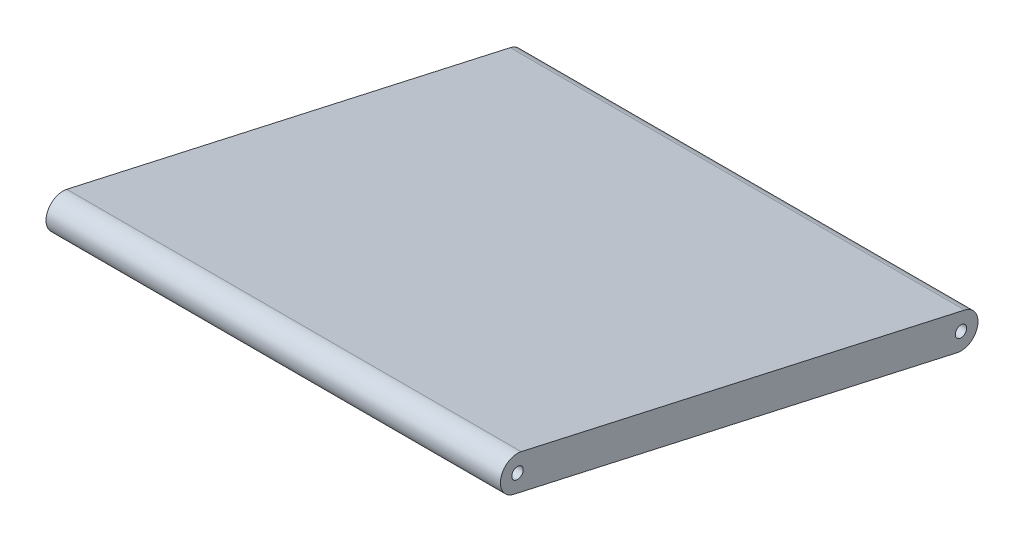
ISO-10303-21;
HEADER;
FILE_DESCRIPTION(('STEP AP214'),'2;1');
FILE_NAME('part.step','',(''),(''),'','','');
FILE_SCHEMA(('AUTOMOTIVE_DESIGN { 1 0 10303 214 1 1 1 1 }'));
ENDSEC;
DATA;
#1=APPLICATION_CONTEXT('core data for automotive mechanical design processes');
#2=APPLICATION_PROTOCOL_DEFINITION('international standard','automotive_design',2000,#1);
#3=PRODUCT_CONTEXT('',#1,'mechanical');
#4=PRODUCT('Part','Part','',(#3));
#5=PRODUCT_RELATED_PRODUCT_CATEGORY('part','',(#4));
#6=PRODUCT_DEFINITION_FORMATION('','',#4);
#7=PRODUCT_DEFINITION_CONTEXT('part definition',#1,'design');
#8=PRODUCT_DEFINITION('design','',#6,#7);
#9=PRODUCT_DEFINITION_SHAPE('','',#8);
#10=(LENGTH_UNIT() NAMED_UNIT(*) SI_UNIT(.MILLI.,.METRE.));
#11=(NAMED_UNIT(*) PLANE_ANGLE_UNIT() SI_UNIT($,.RADIAN.));
#12=(NAMED_UNIT(*) SI_UNIT($,.STERADIAN.) SOLID_ANGLE_UNIT());
#13=UNCERTAINTY_MEASURE_WITH_UNIT(LENGTH_MEASURE(1.E-05),#10,'distance_accuracy_value','');
#14=(GEOMETRIC_REPRESENTATION_CONTEXT(3) GLOBAL_UNCERTAINTY_ASSIGNED_CONTEXT((#13)) GLOBAL_UNIT_ASSIGNED_CONTEXT((#10,
#11,#12)) REPRESENTATION_CONTEXT('',''));
#15=CARTESIAN_POINT('',(0.,0.,0.));
#16=DIRECTION('',(0.,0.,1.));
#17=DIRECTION('',(1.,0.,0.));
#18=AXIS2_PLACEMENT_3D('',#15,#16,#17);
#19=CARTESIAN_POINT('',(10.,-7.97659614714057,13.6231964941302));
#20=DIRECTION('',(1.,0.,0.));
#21=DIRECTION('',(0.,0.,-1.));
#22=AXIS2_PLACEMENT_3D('',#19,#20,#21);
#23=PLANE('',#22);
#24=CARTESIAN_POINT('',(10.,-7.97659614714057,13.6231964941302));
#25=DIRECTION('',(1.,0.,0.));
#26=DIRECTION('',(0.,0.,-1.));
#27=AXIS2_PLACEMENT_3D('',#24,#25,#26);
#28=CIRCLE('',#27,0.125);
#29=CARTESIAN_POINT('',(10.,-7.97659614714057,13.4981964941302));
#30=VERTEX_POINT('',#29);
#31=EDGE_CURVE('E100',#30,#30,#28,.T.);
#32=ORIENTED_EDGE('',*,*,#31,.F.);
#33=EDGE_LOOP('',(#32));
#34=FACE_BOUND('',#33,.T.);
#35=CARTESIAN_POINT('',(10.,-7.97659614714057,13.6231964941302));
#36=DIRECTION('',(1.,0.,0.));
#37=DIRECTION('',(0.,0.,-1.));
#38=AXIS2_PLACEMENT_3D('',#35,#36,#37);
#39=CIRCLE('',#38,0.375000000000003);
#40=CARTESIAN_POINT('',(10.,-7.61061730611043,13.5414377764407));
#41=VERTEX_POINT('',#40);
#42=CARTESIAN_POINT('',(10.,-8.34257498817072,13.7049552118198));
#43=VERTEX_POINT('',#42);
#44=EDGE_CURVE('E85',#41,#43,#39,.T.);
#45=ORIENTED_EDGE('',*,*,#44,.T.);
#46=DIRECTION('',(0.,-0.218023247172055,-0.975943576080376));
#47=VECTOR('',#46,1.);
#48=CARTESIAN_POINT('',(10.,-8.34257498817072,13.7049552118198));
#49=LINE('',#48,#47);
#50=CARTESIAN_POINT('',(10.,-10.5228074598913,3.945519451016));
#51=VERTEX_POINT('',#50);
#52=EDGE_CURVE('E80',#43,#51,#49,.T.);
#53=ORIENTED_EDGE('',*,*,#52,.T.);
#54=CARTESIAN_POINT('',(10.,-10.1568286188611,3.86376073332648));
#55=DIRECTION('',(1.,0.,0.));
#56=DIRECTION('',(0.,0.,-1.));
#57=AXIS2_PLACEMENT_3D('',#54,#55,#56);
#58=CIRCLE('',#57,0.375000000000002);
#59=CARTESIAN_POINT('',(10.,-9.79084977783098,3.78200201563696));
#60=VERTEX_POINT('',#59);
#61=EDGE_CURVE('E83',#51,#60,#58,.T.);
#62=ORIENTED_EDGE('',*,*,#61,.T.);
#63=DIRECTION('',(0.,0.218023247172055,0.975943576080376));
#64=VECTOR('',#63,1.);
#65=CARTESIAN_POINT('',(10.,-7.61061730611043,13.5414377764407));
#66=LINE('',#65,#64);
#67=EDGE_CURVE('E50',#60,#41,#66,.T.);
#68=ORIENTED_EDGE('',*,*,#67,.T.);
#69=EDGE_LOOP('',(#45,#53,#62,#68));
#70=FACE_BOUND('',#69,.T.);
#71=CARTESIAN_POINT('',(10.,-10.1568286188611,3.86376073332648));
#72=DIRECTION('',(1.,0.,0.));
#73=DIRECTION('',(0.,0.,-1.));
#74=AXIS2_PLACEMENT_3D('',#71,#72,#73);
#75=CIRCLE('',#74,0.125);
#76=CARTESIAN_POINT('',(10.,-10.1568286188611,3.73876073332648));
#77=VERTEX_POINT('',#76);
#78=EDGE_CURVE('E115',#77,#77,#75,.T.);
#79=ORIENTED_EDGE('',*,*,#78,.F.);
#80=EDGE_LOOP('',(#79));
#81=FACE_BOUND('',#80,.T.);
#82=ADVANCED_FACE('F33',(#34,#70,#81),#23,.T.);
#83=CARTESIAN_POINT('',(0.,-7.97659614714057,13.6231964941302));
#84=DIRECTION('',(1.,0.,0.));
#85=DIRECTION('',(0.,0.,-1.));
#86=AXIS2_PLACEMENT_3D('',#83,#84,#85);
#87=PLANE('',#86);
#88=CARTESIAN_POINT('',(0.,-7.97659614714057,13.6231964941302));
#89=DIRECTION('',(1.,0.,0.));
#90=DIRECTION('',(0.,0.,-1.));
#91=AXIS2_PLACEMENT_3D('',#88,#89,#90);
#92=CIRCLE('',#91,0.375000000000003);
#93=CARTESIAN_POINT('',(0.,-7.61061730611043,13.5414377764407));
#94=VERTEX_POINT('',#93);
#95=CARTESIAN_POINT('',(0.,-8.34257498817072,13.7049552118198));
#96=VERTEX_POINT('',#95);
#97=EDGE_CURVE('E97',#94,#96,#92,.T.);
#98=ORIENTED_EDGE('',*,*,#97,.F.);
#99=DIRECTION('',(0.,0.218023247172055,0.975943576080376));
#100=VECTOR('',#99,1.);
#101=CARTESIAN_POINT('',(0.,-7.61061730611043,13.5414377764407));
#102=LINE('',#101,#100);
#103=CARTESIAN_POINT('',(0.,-9.79084977783098,3.78200201563696));
#104=VERTEX_POINT('',#103);
#105=EDGE_CURVE('E73',#104,#94,#102,.T.);
#106=ORIENTED_EDGE('',*,*,#105,.F.);
#107=CARTESIAN_POINT('',(0.,-10.1568286188611,3.86376073332648));
#108=DIRECTION('',(1.,0.,0.));
#109=DIRECTION('',(0.,0.,-1.));
#110=AXIS2_PLACEMENT_3D('',#107,#108,#109);
#111=CIRCLE('',#110,0.375000000000002);
#112=CARTESIAN_POINT('',(0.,-10.5228074598913,3.945519451016));
#113=VERTEX_POINT('',#112);
#114=EDGE_CURVE('E67',#113,#104,#111,.T.);
#115=ORIENTED_EDGE('',*,*,#114,.F.);
#116=DIRECTION('',(0.,-0.218023247172055,-0.975943576080376));
#117=VECTOR('',#116,1.);
#118=CARTESIAN_POINT('',(0.,-8.34257498817072,13.7049552118198));
#119=LINE('',#118,#117);
#120=EDGE_CURVE('E89',#96,#113,#119,.T.);
#121=ORIENTED_EDGE('',*,*,#120,.F.);
#122=EDGE_LOOP('',(#98,#106,#115,#121));
#123=FACE_BOUND('',#122,.T.);
#124=CARTESIAN_POINT('',(0.,-7.97659614714057,13.6231964941302));
#125=DIRECTION('',(1.,0.,0.));
#126=DIRECTION('',(0.,0.,-1.));
#127=AXIS2_PLACEMENT_3D('',#124,#125,#126);
#128=CIRCLE('',#127,0.125);
#129=CARTESIAN_POINT('',(0.,-7.97659614714057,13.4981964941302));
#130=VERTEX_POINT('',#129);
#131=EDGE_CURVE('E112',#130,#130,#128,.T.);
#132=ORIENTED_EDGE('',*,*,#131,.T.);
#133=EDGE_LOOP('',(#132));
#134=FACE_BOUND('',#133,.T.);
#135=CARTESIAN_POINT('',(0.,-10.1568286188611,3.86376073332648));
#136=DIRECTION('',(1.,0.,0.));
#137=DIRECTION('',(0.,0.,-1.));
#138=AXIS2_PLACEMENT_3D('',#135,#136,#137);
#139=CIRCLE('',#138,0.125);
#140=CARTESIAN_POINT('',(0.,-10.1568286188611,3.73876073332648));
#141=VERTEX_POINT('',#140);
#142=EDGE_CURVE('E118',#141,#141,#139,.T.);
#143=ORIENTED_EDGE('',*,*,#142,.T.);
#144=EDGE_LOOP('',(#143));
#145=FACE_BOUND('',#144,.T.);
#146=ADVANCED_FACE('F108',(#123,#134,#145),#87,.F.);
#147=CARTESIAN_POINT('',(10.,-7.97659614714057,13.6231964941302));
#148=DIRECTION('',(-1.,0.,0.));
#149=DIRECTION('',(0.,0.,1.));
#150=AXIS2_PLACEMENT_3D('',#147,#148,#149);
#151=CYLINDRICAL_SURFACE('',#150,0.375000000000003);
#152=ORIENTED_EDGE('',*,*,#97,.T.);
#153=DIRECTION('',(-1.,0.,0.));
#154=VECTOR('',#153,1.);
#155=CARTESIAN_POINT('',(10.,-8.34257498817072,13.7049552118198));
#156=LINE('',#155,#154);
#157=EDGE_CURVE('E11',#43,#96,#156,.T.);
#158=ORIENTED_EDGE('',*,*,#157,.F.);
#159=ORIENTED_EDGE('',*,*,#44,.F.);
#160=DIRECTION('',(-1.,0.,0.));
#161=VECTOR('',#160,1.);
#162=CARTESIAN_POINT('',(10.,-7.61061730611043,13.5414377764407));
#163=LINE('',#162,#161);
#164=EDGE_CURVE('E93',#41,#94,#163,.T.);
#165=ORIENTED_EDGE('',*,*,#164,.T.);
#166=EDGE_LOOP('',(#152,#158,#159,#165));
#167=FACE_BOUND('',#166,.T.);
#168=ADVANCED_FACE('F35',(#167),#151,.T.);
#169=CARTESIAN_POINT('',(10.,-8.34257498817072,13.7049552118198));
#170=DIRECTION('',(0.,0.975943576080376,-0.218023247172055));
#171=DIRECTION('',(0.,0.218023247172055,0.975943576080376));
#172=AXIS2_PLACEMENT_3D('',#169,#170,#171);
#173=PLANE('',#172);
#174=ORIENTED_EDGE('',*,*,#120,.T.);
#175=DIRECTION('',(-1.,0.,0.));
#176=VECTOR('',#175,1.);
#177=CARTESIAN_POINT('',(10.,-10.5228074598913,3.945519451016));
#178=LINE('',#177,#176);
#179=EDGE_CURVE('E42',#51,#113,#178,.T.);
#180=ORIENTED_EDGE('',*,*,#179,.F.);
#181=ORIENTED_EDGE('',*,*,#52,.F.);
#182=ORIENTED_EDGE('',*,*,#157,.T.);
#183=EDGE_LOOP('',(#174,#180,#181,#182));
#184=FACE_BOUND('',#183,.T.);
#185=ADVANCED_FACE('F88',(#184),#173,.F.);
#186=CARTESIAN_POINT('',(10.,-10.1568286188611,3.86376073332648));
#187=DIRECTION('',(-1.,0.,0.));
#188=DIRECTION('',(0.,0.,1.));
#189=AXIS2_PLACEMENT_3D('',#186,#187,#188);
#190=CYLINDRICAL_SURFACE('',#189,0.375000000000002);
#191=ORIENTED_EDGE('',*,*,#114,.T.);
#192=DIRECTION('',(-1.,0.,0.));
#193=VECTOR('',#192,1.);
#194=CARTESIAN_POINT('',(10.,-9.79084977783098,3.78200201563696));
#195=LINE('',#194,#193);
#196=EDGE_CURVE('E90',#60,#104,#195,.T.);
#197=ORIENTED_EDGE('',*,*,#196,.F.);
#198=ORIENTED_EDGE('',*,*,#61,.F.);
#199=ORIENTED_EDGE('',*,*,#179,.T.);
#200=EDGE_LOOP('',(#191,#197,#198,#199));
#201=FACE_BOUND('',#200,.T.);
#202=ADVANCED_FACE('F91',(#201),#190,.T.);
#203=CARTESIAN_POINT('',(10.,-7.61061730611043,13.5414377764407));
#204=DIRECTION('',(0.,-0.975943576080376,0.218023247172055));
#205=DIRECTION('',(0.,-0.218023247172055,-0.975943576080376));
#206=AXIS2_PLACEMENT_3D('',#203,#204,#205);
#207=PLANE('',#206);
#208=ORIENTED_EDGE('',*,*,#105,.T.);
#209=ORIENTED_EDGE('',*,*,#164,.F.);
#210=ORIENTED_EDGE('',*,*,#67,.F.);
#211=ORIENTED_EDGE('',*,*,#196,.T.);
#212=EDGE_LOOP('',(#208,#209,#210,#211));
#213=FACE_BOUND('',#212,.T.);
#214=ADVANCED_FACE('F105',(#213),#207,.F.);
#215=CARTESIAN_POINT('',(10.,-7.97659614714057,13.6231964941302));
#216=DIRECTION('',(-1.,0.,0.));
#217=DIRECTION('',(0.,0.,1.));
#218=AXIS2_PLACEMENT_3D('',#215,#216,#217);
#219=CYLINDRICAL_SURFACE('',#218,0.125);
#220=ORIENTED_EDGE('',*,*,#31,.T.);
#221=EDGE_LOOP('',(#220));
#222=FACE_BOUND('',#221,.T.);
#223=ORIENTED_EDGE('',*,*,#131,.F.);
#224=EDGE_LOOP('',(#223));
#225=FACE_BOUND('',#224,.T.);
#226=ADVANCED_FACE('F135',(#222,#225),#219,.F.);
#227=CARTESIAN_POINT('',(10.,-10.1568286188611,3.86376073332648));
#228=DIRECTION('',(-1.,0.,0.));
#229=DIRECTION('',(0.,0.,1.));
#230=AXIS2_PLACEMENT_3D('',#227,#228,#229);
#231=CYLINDRICAL_SURFACE('',#230,0.125);
#232=ORIENTED_EDGE('',*,*,#78,.T.);
#233=EDGE_LOOP('',(#232));
#234=FACE_BOUND('',#233,.T.);
#235=ORIENTED_EDGE('',*,*,#142,.F.);
#236=EDGE_LOOP('',(#235));
#237=FACE_BOUND('',#236,.T.);
#238=ADVANCED_FACE('F124',(#234,#237),#231,.F.);
#239=CLOSED_SHELL('',(#82,#146,#168,#185,#202,#214,#226,#238));
#240=MANIFOLD_SOLID_BREP('B2',#239);
#241=ADVANCED_BREP_SHAPE_REPRESENTATION('',(#18,#240),#14);
#242=SHAPE_DEFINITION_REPRESENTATION(#9,#241);
ENDSEC;
END-ISO-10303-21;
